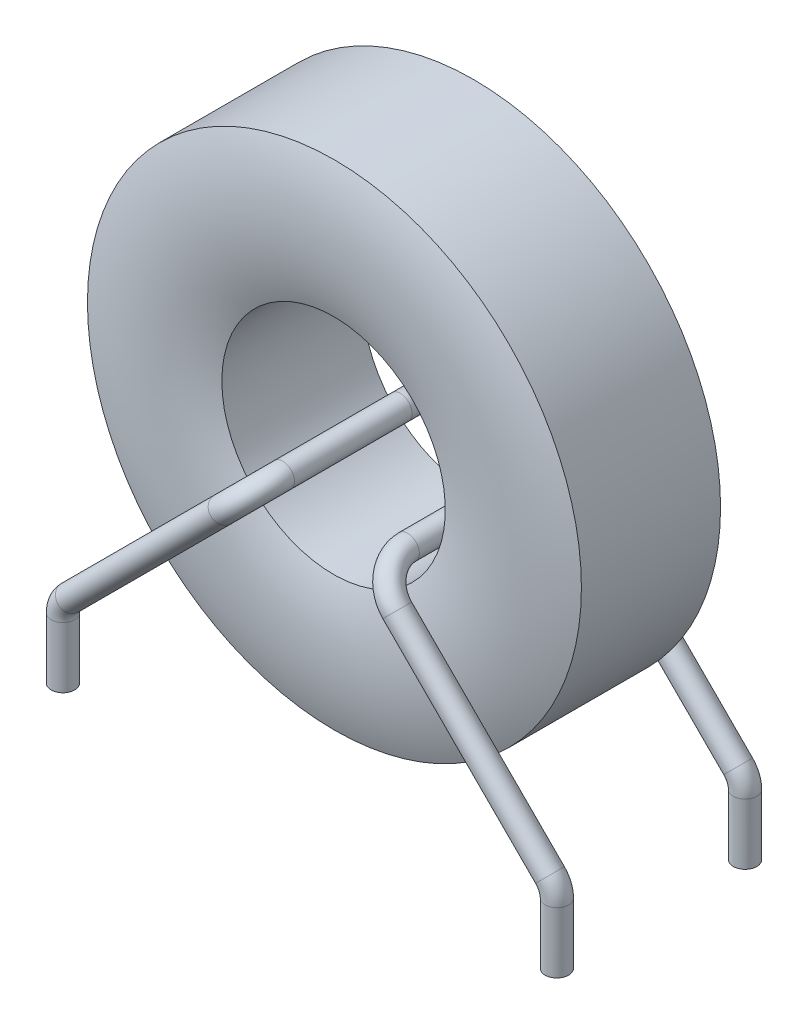
ISO-10303-21;
HEADER;
FILE_DESCRIPTION(('STEP AP214'),'2;1');
FILE_NAME('part.step','',(''),(''),'','','');
FILE_SCHEMA(('AUTOMOTIVE_DESIGN { 1 0 10303 214 1 1 1 1 }'));
ENDSEC;
DATA;
#1=APPLICATION_CONTEXT('core data for automotive mechanical design processes');
#2=APPLICATION_PROTOCOL_DEFINITION('international standard','automotive_design',2000,#1);
#3=PRODUCT_CONTEXT('',#1,'mechanical');
#4=PRODUCT('Part','Part','',(#3));
#5=PRODUCT_RELATED_PRODUCT_CATEGORY('part','',(#4));
#6=PRODUCT_DEFINITION_FORMATION('','',#4);
#7=PRODUCT_DEFINITION_CONTEXT('part definition',#1,'design');
#8=PRODUCT_DEFINITION('design','',#6,#7);
#9=PRODUCT_DEFINITION_SHAPE('','',#8);
#10=(LENGTH_UNIT() NAMED_UNIT(*) SI_UNIT(.MILLI.,.METRE.));
#11=(NAMED_UNIT(*) PLANE_ANGLE_UNIT() SI_UNIT($,.RADIAN.));
#12=(NAMED_UNIT(*) SI_UNIT($,.STERADIAN.) SOLID_ANGLE_UNIT());
#13=UNCERTAINTY_MEASURE_WITH_UNIT(LENGTH_MEASURE(1.E-05),#10,'distance_accuracy_value','');
#14=(GEOMETRIC_REPRESENTATION_CONTEXT(3) GLOBAL_UNCERTAINTY_ASSIGNED_CONTEXT((#13)) GLOBAL_UNIT_ASSIGNED_CONTEXT((#10,
#11,#12)) REPRESENTATION_CONTEXT('',''));
#15=CARTESIAN_POINT('',(0.,0.,0.));
#16=DIRECTION('',(0.,0.,1.));
#17=DIRECTION('',(1.,0.,0.));
#18=AXIS2_PLACEMENT_3D('',#15,#16,#17);
#19=CARTESIAN_POINT('',(10.5000000000002,-10.9142135623731,4.));
#20=DIRECTION('',(0.,-1.,0.));
#21=DIRECTION('',(0.,0.,-1.));
#22=AXIS2_PLACEMENT_3D('',#19,#20,#21);
#23=CYLINDRICAL_SURFACE('',#22,0.5);
#24=CARTESIAN_POINT('',(10.5000000000002,-10.9142135623731,4.));
#25=DIRECTION('',(0.,-1.,0.));
#26=DIRECTION('',(0.707106781186538,0.,-0.707106781186557));
#27=AXIS2_PLACEMENT_3D('',#24,#25,#26);
#28=CIRCLE('',#27,0.5);
#29=CARTESIAN_POINT('',(11.0000000000002,-10.9142135623731,4.));
#30=VERTEX_POINT('',#29);
#31=EDGE_CURVE('E56',#30,#30,#28,.T.);
#32=ORIENTED_EDGE('',*,*,#31,.T.);
#33=EDGE_LOOP('',(#32));
#34=FACE_BOUND('',#33,.T.);
#35=CARTESIAN_POINT('',(10.5000000000002,-13.5,4.));
#36=DIRECTION('',(0.,-1.,0.));
#37=DIRECTION('',(0.707106781186538,0.,-0.707106781186557));
#38=AXIS2_PLACEMENT_3D('',#35,#36,#37);
#39=CIRCLE('',#38,0.5);
#40=CARTESIAN_POINT('',(10.8535533905935,-13.5,3.64644660940672));
#41=VERTEX_POINT('',#40);
#42=EDGE_CURVE('E11',#41,#41,#39,.T.);
#43=ORIENTED_EDGE('',*,*,#42,.F.);
#44=EDGE_LOOP('',(#43));
#45=FACE_BOUND('',#44,.T.);
#46=ADVANCED_FACE('F49',(#34,#45),#23,.T.);
#47=CARTESIAN_POINT('',(9.50000000000018,-10.9142135623731,4.));
#48=DIRECTION('',(0.,0.,-1.));
#49=DIRECTION('',(-1.,0.,0.));
#50=AXIS2_PLACEMENT_3D('',#47,#48,#49);
#51=TOROIDAL_SURFACE('',#50,1.00000000000001,0.5);
#52=CARTESIAN_POINT('',(10.2071067811867,-10.2071067811865,4.));
#53=DIRECTION('',(0.707106781186557,-0.707106781186538,0.));
#54=DIRECTION('',(0.499999999999987,0.5,-0.707106781186557));
#55=AXIS2_PLACEMENT_3D('',#52,#53,#54);
#56=CIRCLE('',#55,0.5);
#57=CARTESIAN_POINT('',(10.56066017178,-9.85355339059326,4.));
#58=VERTEX_POINT('',#57);
#59=EDGE_CURVE('E62',#58,#58,#56,.T.);
#60=CARTESIAN_POINT('',(9.50000000000018,-10.9142135623731,4.));
#61=DIRECTION('',(0.,0.,-1.));
#62=DIRECTION('',(-1.,0.,0.));
#63=AXIS2_PLACEMENT_3D('',#60,#61,#62);
#64=CIRCLE('',#63,1.50000000000001);
#65=EDGE_CURVE('',#58,#30,#64,.T.);
#66=ORIENTED_EDGE('',*,*,#59,.T.);
#67=ORIENTED_EDGE('',*,*,#31,.F.);
#68=ORIENTED_EDGE('',*,*,#65,.T.);
#69=ORIENTED_EDGE('',*,*,#65,.F.);
#70=EDGE_LOOP('',(#66,#68,#67,#69));
#71=FACE_BOUND('',#70,.T.);
#72=ADVANCED_FACE('F130',(#71),#51,.T.);
#73=CARTESIAN_POINT('',(3.71231060122939,-3.71231060122936,4.));
#74=DIRECTION('',(0.707106781186556,-0.707106781186539,0.));
#75=DIRECTION('',(0.707106781186539,0.707106781186556,0.));
#76=AXIS2_PLACEMENT_3D('',#73,#74,#75);
#77=CYLINDRICAL_SURFACE('',#76,0.5);
#78=CARTESIAN_POINT('',(3.71231060122939,-3.71231060122936,4.));
#79=DIRECTION('',(0.707106781186557,-0.707106781186538,0.));
#80=DIRECTION('',(0.499999999999987,0.5,-0.707106781186557));
#81=AXIS2_PLACEMENT_3D('',#78,#79,#80);
#82=CIRCLE('',#81,0.5);
#83=CARTESIAN_POINT('',(3.71231060122939,-3.71231060122936,4.5));
#84=VERTEX_POINT('',#83);
#85=EDGE_CURVE('E66',#84,#84,#82,.T.);
#86=ORIENTED_EDGE('',*,*,#85,.T.);
#87=EDGE_LOOP('',(#86));
#88=FACE_BOUND('',#87,.T.);
#89=ORIENTED_EDGE('',*,*,#59,.F.);
#90=EDGE_LOOP('',(#89));
#91=FACE_BOUND('',#90,.T.);
#92=ADVANCED_FACE('F134',(#88,#91),#77,.T.);
#93=CARTESIAN_POINT('',(3.71231060122939,-3.71231060122936,2.5));
#94=DIRECTION('',(0.707106781186538,0.707106781186557,0.));
#95=DIRECTION('',(-0.707106781186557,0.707106781186538,0.));
#96=AXIS2_PLACEMENT_3D('',#93,#94,#95);
#97=TOROIDAL_SURFACE('',#96,1.5,0.5);
#98=CARTESIAN_POINT('',(2.65165042944955,-2.65165042944955,2.5));
#99=DIRECTION('',(0.,0.,1.));
#100=DIRECTION('',(1.,0.,0.));
#101=AXIS2_PLACEMENT_3D('',#98,#99,#100);
#102=CIRCLE('',#101,0.5);
#103=CARTESIAN_POINT('',(2.29809703885627,-2.29809703885628,2.5));
#104=VERTEX_POINT('',#103);
#105=EDGE_CURVE('E72',#104,#104,#102,.T.);
#106=CARTESIAN_POINT('',(3.71231060122939,-3.71231060122936,2.5));
#107=DIRECTION('',(0.707106781186538,0.707106781186557,0.));
#108=DIRECTION('',(-0.707106781186557,0.707106781186538,0.));
#109=AXIS2_PLACEMENT_3D('',#106,#107,#108);
#110=CIRCLE('',#109,2.);
#111=EDGE_CURVE('',#104,#84,#110,.T.);
#112=ORIENTED_EDGE('',*,*,#105,.T.);
#113=ORIENTED_EDGE('',*,*,#85,.F.);
#114=ORIENTED_EDGE('',*,*,#111,.T.);
#115=ORIENTED_EDGE('',*,*,#111,.F.);
#116=EDGE_LOOP('',(#112,#114,#113,#115));
#117=FACE_BOUND('',#116,.T.);
#118=ADVANCED_FACE('F140',(#117),#97,.T.);
#119=CARTESIAN_POINT('',(2.65165042944955,-2.65165042944955,2.5));
#120=DIRECTION('',(0.,0.,-1.));
#121=DIRECTION('',(-1.,0.,0.));
#122=AXIS2_PLACEMENT_3D('',#119,#120,#121);
#123=CYLINDRICAL_SURFACE('',#122,0.5);
#124=ORIENTED_EDGE('',*,*,#105,.F.);
#125=EDGE_LOOP('',(#124));
#126=FACE_BOUND('',#125,.T.);
#127=CARTESIAN_POINT('',(2.65165042944955,-2.65165042944955,-2.5));
#128=DIRECTION('',(0.,0.,1.));
#129=DIRECTION('',(1.,0.,0.));
#130=AXIS2_PLACEMENT_3D('',#127,#128,#129);
#131=CIRCLE('',#130,0.5);
#132=CARTESIAN_POINT('',(2.29809703885627,-2.29809703885628,-2.5));
#133=VERTEX_POINT('',#132);
#134=EDGE_CURVE('E92',#133,#133,#131,.T.);
#135=ORIENTED_EDGE('',*,*,#134,.T.);
#136=EDGE_LOOP('',(#135));
#137=FACE_BOUND('',#136,.T.);
#138=ADVANCED_FACE('F97',(#126,#137),#123,.T.);
#139=CARTESIAN_POINT('',(10.5000000000002,-13.5,4.));
#140=DIRECTION('',(0.,-1.,0.));
#141=DIRECTION('',(0.707106781186538,0.,-0.707106781186557));
#142=AXIS2_PLACEMENT_3D('',#139,#140,#141);
#143=PLANE('',#142);
#144=ORIENTED_EDGE('',*,*,#42,.T.);
#145=EDGE_LOOP('',(#144));
#146=FACE_BOUND('',#145,.T.);
#147=ADVANCED_FACE('F121',(#146),#143,.T.);
#148=CARTESIAN_POINT('',(10.5000000000002,-10.9142135623731,-4.00000000000002));
#149=DIRECTION('',(0.,-1.,0.));
#150=DIRECTION('',(1.,0.,0.));
#151=AXIS2_PLACEMENT_3D('',#148,#149,#150);
#152=CYLINDRICAL_SURFACE('',#151,0.5);
#153=CARTESIAN_POINT('',(10.5000000000002,-10.9142135623731,-4.00000000000002));
#154=DIRECTION('',(0.,1.,0.));
#155=DIRECTION('',(0.707106781186538,0.,0.707106781186557));
#156=AXIS2_PLACEMENT_3D('',#153,#154,#155);
#157=CIRCLE('',#156,0.5);
#158=CARTESIAN_POINT('',(11.0000000000002,-10.9142135623731,-4.00000000000002));
#159=VERTEX_POINT('',#158);
#160=EDGE_CURVE('E80',#159,#159,#157,.T.);
#161=ORIENTED_EDGE('',*,*,#160,.F.);
#162=EDGE_LOOP('',(#161));
#163=FACE_BOUND('',#162,.T.);
#164=CARTESIAN_POINT('',(10.5000000000002,-13.5,-4.00000000000002));
#165=DIRECTION('',(0.,1.,0.));
#166=DIRECTION('',(0.707106781186538,0.,0.707106781186557));
#167=AXIS2_PLACEMENT_3D('',#164,#165,#166);
#168=CIRCLE('',#167,0.5);
#169=CARTESIAN_POINT('',(10.8535533905935,-13.5,-3.64644660940674));
#170=VERTEX_POINT('',#169);
#171=EDGE_CURVE('E76',#170,#170,#168,.T.);
#172=ORIENTED_EDGE('',*,*,#171,.T.);
#173=EDGE_LOOP('',(#172));
#174=FACE_BOUND('',#173,.T.);
#175=ADVANCED_FACE('F115',(#163,#174),#152,.T.);
#176=CARTESIAN_POINT('',(9.50000000000018,-10.9142135623731,-4.00000000000002));
#177=DIRECTION('',(0.,0.,-1.));
#178=DIRECTION('',(-1.,0.,0.));
#179=AXIS2_PLACEMENT_3D('',#176,#177,#178);
#180=TOROIDAL_SURFACE('',#179,1.00000000000001,0.5);
#181=CARTESIAN_POINT('',(10.2071067811867,-10.2071067811865,-4.00000000000002));
#182=DIRECTION('',(-0.707106781186557,0.707106781186538,0.));
#183=DIRECTION('',(0.499999999999988,0.499999999999999,0.707106781186557));
#184=AXIS2_PLACEMENT_3D('',#181,#182,#183);
#185=CIRCLE('',#184,0.5);
#186=CARTESIAN_POINT('',(10.56066017178,-9.85355339059325,-4.00000000000002));
#187=VERTEX_POINT('',#186);
#188=EDGE_CURVE('E84',#187,#187,#185,.T.);
#189=CARTESIAN_POINT('',(9.50000000000018,-10.9142135623731,-4.00000000000002));
#190=DIRECTION('',(0.,0.,-1.));
#191=DIRECTION('',(-1.,0.,0.));
#192=AXIS2_PLACEMENT_3D('',#189,#190,#191);
#193=CIRCLE('',#192,1.50000000000001);
#194=EDGE_CURVE('',#187,#159,#193,.T.);
#195=ORIENTED_EDGE('',*,*,#188,.F.);
#196=ORIENTED_EDGE('',*,*,#160,.T.);
#197=ORIENTED_EDGE('',*,*,#194,.T.);
#198=ORIENTED_EDGE('',*,*,#194,.F.);
#199=EDGE_LOOP('',(#195,#197,#196,#198));
#200=FACE_BOUND('',#199,.T.);
#201=ADVANCED_FACE('F109',(#200),#180,.T.);
#202=CARTESIAN_POINT('',(3.71231060122939,-3.71231060122936,-4.));
#203=DIRECTION('',(0.707106781186557,-0.707106781186538,0.));
#204=DIRECTION('',(0.707106781186538,0.707106781186557,0.));
#205=AXIS2_PLACEMENT_3D('',#202,#203,#204);
#206=CYLINDRICAL_SURFACE('',#205,0.5);
#207=CARTESIAN_POINT('',(3.71231060122939,-3.71231060122936,-4.));
#208=DIRECTION('',(-0.707106781186557,0.707106781186538,0.));
#209=DIRECTION('',(0.499999999999988,0.499999999999999,0.707106781186557));
#210=AXIS2_PLACEMENT_3D('',#207,#208,#209);
#211=CIRCLE('',#210,0.5);
#212=CARTESIAN_POINT('',(3.71231060122939,-3.71231060122936,-4.5));
#213=VERTEX_POINT('',#212);
#214=EDGE_CURVE('E88',#213,#213,#211,.T.);
#215=ORIENTED_EDGE('',*,*,#214,.F.);
#216=EDGE_LOOP('',(#215));
#217=FACE_BOUND('',#216,.T.);
#218=ORIENTED_EDGE('',*,*,#188,.T.);
#219=EDGE_LOOP('',(#218));
#220=FACE_BOUND('',#219,.T.);
#221=ADVANCED_FACE('F103',(#217,#220),#206,.T.);
#222=CARTESIAN_POINT('',(3.71231060122939,-3.71231060122936,-2.5));
#223=DIRECTION('',(-0.707106781186538,-0.707106781186557,0.));
#224=DIRECTION('',(0.707106781186557,-0.707106781186538,0.));
#225=AXIS2_PLACEMENT_3D('',#222,#223,#224);
#226=TOROIDAL_SURFACE('',#225,1.5,0.5);
#227=CARTESIAN_POINT('',(3.71231060122939,-3.71231060122936,-2.5));
#228=DIRECTION('',(-0.707106781186538,-0.707106781186557,0.));
#229=DIRECTION('',(0.707106781186557,-0.707106781186538,0.));
#230=AXIS2_PLACEMENT_3D('',#227,#228,#229);
#231=CIRCLE('',#230,2.);
#232=EDGE_CURVE('',#133,#213,#231,.T.);
#233=ORIENTED_EDGE('',*,*,#134,.F.);
#234=ORIENTED_EDGE('',*,*,#214,.T.);
#235=ORIENTED_EDGE('',*,*,#232,.T.);
#236=ORIENTED_EDGE('',*,*,#232,.F.);
#237=EDGE_LOOP('',(#233,#235,#234,#236));
#238=FACE_BOUND('',#237,.T.);
#239=ADVANCED_FACE('F99',(#238),#226,.T.);
#240=CARTESIAN_POINT('',(10.5000000000002,-13.5,-4.00000000000002));
#241=DIRECTION('',(0.,1.,0.));
#242=DIRECTION('',(0.707106781186538,0.,0.707106781186557));
#243=AXIS2_PLACEMENT_3D('',#240,#241,#242);
#244=PLANE('',#243);
#245=ORIENTED_EDGE('',*,*,#171,.F.);
#246=EDGE_LOOP('',(#245));
#247=FACE_BOUND('',#246,.T.);
#248=ADVANCED_FACE('F102',(#247),#244,.F.);
#249=CLOSED_SHELL('',(#46,#72,#92,#118,#138,#147,#175,#201,#221,#239,#248));
#250=MANIFOLD_SOLID_BREP('B2',#249);
#251=CARTESIAN_POINT('',(-10.5,-10.9142135623731,3.99999997942051));
#252=DIRECTION('',(0.,-1.,0.));
#253=DIRECTION('',(1.,0.,0.));
#254=AXIS2_PLACEMENT_3D('',#251,#252,#253);
#255=CYLINDRICAL_SURFACE('',#254,0.5);
#256=CARTESIAN_POINT('',(-10.5,-10.9142135623731,3.99999997942051));
#257=DIRECTION('',(0.,-1.,0.));
#258=DIRECTION('',(0.707106781186549,0.,0.707106781186546));
#259=AXIS2_PLACEMENT_3D('',#256,#257,#258);
#260=CIRCLE('',#259,0.5);
#261=CARTESIAN_POINT('',(-11.,-10.9142135623731,3.99999997942051));
#262=VERTEX_POINT('',#261);
#263=EDGE_CURVE('E247',#262,#262,#260,.T.);
#264=ORIENTED_EDGE('',*,*,#263,.T.);
#265=EDGE_LOOP('',(#264));
#266=FACE_BOUND('',#265,.T.);
#267=CARTESIAN_POINT('',(-10.5,-13.5,3.99999997942051));
#268=DIRECTION('',(0.,-1.,0.));
#269=DIRECTION('',(0.707106781186549,0.,0.707106781186546));
#270=AXIS2_PLACEMENT_3D('',#267,#268,#269);
#271=CIRCLE('',#270,0.5);
#272=CARTESIAN_POINT('',(-10.1464466094067,-13.5,4.35355337001378));
#273=VERTEX_POINT('',#272);
#274=EDGE_CURVE('E48',#273,#273,#271,.T.);
#275=ORIENTED_EDGE('',*,*,#274,.F.);
#276=EDGE_LOOP('',(#275));
#277=FACE_BOUND('',#276,.T.);
#278=ADVANCED_FACE('F240',(#266,#277),#255,.T.);
#279=CARTESIAN_POINT('',(-9.49999999999999,-10.9142135623731,3.9999999794205));
#280=DIRECTION('',(0.,0.,1.));
#281=DIRECTION('',(1.,0.,0.));
#282=AXIS2_PLACEMENT_3D('',#279,#280,#281);
#283=TOROIDAL_SURFACE('',#282,1.,0.5);
#284=CARTESIAN_POINT('',(-10.2071067811865,-10.2071067811865,3.99999997942051));
#285=DIRECTION('',(-0.707106781186548,-0.707106781186548,0.));
#286=DIRECTION('',(0.500000000000001,-0.499999999999999,0.707106781186548));
#287=AXIS2_PLACEMENT_3D('',#284,#285,#286);
#288=CIRCLE('',#287,0.5);
#289=CARTESIAN_POINT('',(-10.5606601717798,-9.85355339059327,3.99999997942051));
#290=VERTEX_POINT('',#289);
#291=EDGE_CURVE('E253',#290,#290,#288,.T.);
#292=CARTESIAN_POINT('',(-9.49999999999999,-10.9142135623731,3.9999999794205));
#293=DIRECTION('',(0.,0.,1.));
#294=DIRECTION('',(1.,0.,0.));
#295=AXIS2_PLACEMENT_3D('',#292,#293,#294);
#296=CIRCLE('',#295,1.5);
#297=EDGE_CURVE('',#290,#262,#296,.T.);
#298=ORIENTED_EDGE('',*,*,#291,.T.);
#299=ORIENTED_EDGE('',*,*,#263,.F.);
#300=ORIENTED_EDGE('',*,*,#297,.T.);
#301=ORIENTED_EDGE('',*,*,#297,.F.);
#302=EDGE_LOOP('',(#298,#300,#299,#301));
#303=FACE_BOUND('',#302,.T.);
#304=ADVANCED_FACE('F321',(#303),#283,.T.);
#305=CARTESIAN_POINT('',(-3.71231060122937,-3.71231060122937,3.99999997942048));
#306=DIRECTION('',(-0.707106781186548,-0.707106781186548,0.));
#307=DIRECTION('',(0.707106781186547,-0.707106781186548,0.));
#308=AXIS2_PLACEMENT_3D('',#305,#306,#307);
#309=CYLINDRICAL_SURFACE('',#308,0.5);
#310=CARTESIAN_POINT('',(-3.71231060122937,-3.71231060122937,3.99999997942048));
#311=DIRECTION('',(-0.707106781186548,-0.707106781186548,0.));
#312=DIRECTION('',(0.500000000000001,-0.499999999999999,0.707106781186548));
#313=AXIS2_PLACEMENT_3D('',#310,#311,#312);
#314=CIRCLE('',#313,0.5);
#315=CARTESIAN_POINT('',(-3.71231060122937,-3.71231060122937,4.49999997942048));
#316=VERTEX_POINT('',#315);
#317=EDGE_CURVE('E259',#316,#316,#314,.T.);
#318=ORIENTED_EDGE('',*,*,#317,.T.);
#319=EDGE_LOOP('',(#318));
#320=FACE_BOUND('',#319,.T.);
#321=ORIENTED_EDGE('',*,*,#291,.F.);
#322=EDGE_LOOP('',(#321));
#323=FACE_BOUND('',#322,.T.);
#324=ADVANCED_FACE('F325',(#320,#323),#309,.T.);
#325=CARTESIAN_POINT('',(-3.71231060122937,-3.71231060122937,2.49999997942048));
#326=DIRECTION('',(0.707106781186548,-0.707106781186548,0.));
#327=DIRECTION('',(0.707106781186548,0.707106781186548,0.));
#328=AXIS2_PLACEMENT_3D('',#325,#326,#327);
#329=TOROIDAL_SURFACE('',#328,1.5,0.5);
#330=CARTESIAN_POINT('',(-2.65165042944955,-2.65165042944955,2.49999997942048));
#331=DIRECTION('',(0.,0.,1.));
#332=DIRECTION('',(1.,0.,0.));
#333=AXIS2_PLACEMENT_3D('',#330,#331,#332);
#334=CIRCLE('',#333,0.5);
#335=CARTESIAN_POINT('',(-2.29809703885628,-2.29809703885628,2.49999997942048));
#336=VERTEX_POINT('',#335);
#337=EDGE_CURVE('E265',#336,#336,#334,.T.);
#338=CARTESIAN_POINT('',(-3.71231060122937,-3.71231060122937,2.49999997942048));
#339=DIRECTION('',(0.707106781186548,-0.707106781186548,0.));
#340=DIRECTION('',(0.707106781186548,0.707106781186548,0.));
#341=AXIS2_PLACEMENT_3D('',#338,#339,#340);
#342=CIRCLE('',#341,2.);
#343=EDGE_CURVE('',#336,#316,#342,.T.);
#344=ORIENTED_EDGE('',*,*,#337,.T.);
#345=ORIENTED_EDGE('',*,*,#317,.F.);
#346=ORIENTED_EDGE('',*,*,#343,.T.);
#347=ORIENTED_EDGE('',*,*,#343,.F.);
#348=EDGE_LOOP('',(#344,#346,#345,#347));
#349=FACE_BOUND('',#348,.T.);
#350=ADVANCED_FACE('F331',(#349),#329,.T.);
#351=CARTESIAN_POINT('',(-2.65165042944955,-2.65165042944955,2.49999997942048));
#352=DIRECTION('',(0.,0.,-1.));
#353=DIRECTION('',(-1.,0.,0.));
#354=AXIS2_PLACEMENT_3D('',#351,#352,#353);
#355=CYLINDRICAL_SURFACE('',#354,0.5);
#356=ORIENTED_EDGE('',*,*,#337,.F.);
#357=EDGE_LOOP('',(#356));
#358=FACE_BOUND('',#357,.T.);
#359=CARTESIAN_POINT('',(-2.65165042944955,-2.65165042944955,-2.5));
#360=DIRECTION('',(0.,0.,1.));
#361=DIRECTION('',(1.,0.,0.));
#362=AXIS2_PLACEMENT_3D('',#359,#360,#361);
#363=CIRCLE('',#362,0.5);
#364=CARTESIAN_POINT('',(-2.29809703885628,-2.29809703885628,-2.5));
#365=VERTEX_POINT('',#364);
#366=EDGE_CURVE('E283',#365,#365,#363,.T.);
#367=ORIENTED_EDGE('',*,*,#366,.T.);
#368=EDGE_LOOP('',(#367));
#369=FACE_BOUND('',#368,.T.);
#370=ADVANCED_FACE('F288',(#358,#369),#355,.T.);
#371=CARTESIAN_POINT('',(-10.5,-13.5,3.99999997942051));
#372=DIRECTION('',(0.,-1.,0.));
#373=DIRECTION('',(0.707106781186549,0.,0.707106781186546));
#374=AXIS2_PLACEMENT_3D('',#371,#372,#373);
#375=PLANE('',#374);
#376=ORIENTED_EDGE('',*,*,#274,.T.);
#377=EDGE_LOOP('',(#376));
#378=FACE_BOUND('',#377,.T.);
#379=ADVANCED_FACE('F312',(#378),#375,.T.);
#380=CARTESIAN_POINT('',(-10.5,-10.9142135623731,-4.));
#381=DIRECTION('',(0.,-1.,0.));
#382=DIRECTION('',(0.,0.,-1.));
#383=AXIS2_PLACEMENT_3D('',#380,#381,#382);
#384=CYLINDRICAL_SURFACE('',#383,0.5);
#385=CARTESIAN_POINT('',(-10.5,-10.9142135623731,-4.));
#386=DIRECTION('',(0.,1.,0.));
#387=DIRECTION('',(0.707106781186548,0.,-0.707106781186548));
#388=AXIS2_PLACEMENT_3D('',#385,#386,#387);
#389=CIRCLE('',#388,0.5);
#390=CARTESIAN_POINT('',(-11.,-10.9142135623731,-4.));
#391=VERTEX_POINT('',#390);
#392=EDGE_CURVE('E273',#391,#391,#389,.T.);
#393=ORIENTED_EDGE('',*,*,#392,.F.);
#394=EDGE_LOOP('',(#393));
#395=FACE_BOUND('',#394,.T.);
#396=CARTESIAN_POINT('',(-10.5,-13.5,-4.));
#397=DIRECTION('',(0.,1.,0.));
#398=DIRECTION('',(0.707106781186548,0.,-0.707106781186548));
#399=AXIS2_PLACEMENT_3D('',#396,#397,#398);
#400=CIRCLE('',#399,0.5);
#401=CARTESIAN_POINT('',(-10.1464466094067,-13.5,-4.35355339059327));
#402=VERTEX_POINT('',#401);
#403=EDGE_CURVE('E269',#402,#402,#400,.T.);
#404=ORIENTED_EDGE('',*,*,#403,.T.);
#405=EDGE_LOOP('',(#404));
#406=FACE_BOUND('',#405,.T.);
#407=ADVANCED_FACE('F306',(#395,#406),#384,.T.);
#408=CARTESIAN_POINT('',(-9.5,-10.9142135623731,-4.));
#409=DIRECTION('',(0.,0.,1.));
#410=DIRECTION('',(1.,0.,0.));
#411=AXIS2_PLACEMENT_3D('',#408,#409,#410);
#412=TOROIDAL_SURFACE('',#411,1.,0.5);
#413=CARTESIAN_POINT('',(-10.2071067811865,-10.2071067811865,-4.));
#414=DIRECTION('',(0.707106781186548,0.707106781186548,0.));
#415=DIRECTION('',(0.500000000000001,-0.5,-0.707106781186548));
#416=AXIS2_PLACEMENT_3D('',#413,#414,#415);
#417=CIRCLE('',#416,0.5);
#418=CARTESIAN_POINT('',(-10.5606601717798,-9.85355339059327,-4.));
#419=VERTEX_POINT('',#418);
#420=EDGE_CURVE('E277',#419,#419,#417,.T.);
#421=CARTESIAN_POINT('',(-9.5,-10.9142135623731,-4.));
#422=DIRECTION('',(0.,0.,1.));
#423=DIRECTION('',(1.,0.,0.));
#424=AXIS2_PLACEMENT_3D('',#421,#422,#423);
#425=CIRCLE('',#424,1.5);
#426=EDGE_CURVE('',#419,#391,#425,.T.);
#427=ORIENTED_EDGE('',*,*,#420,.F.);
#428=ORIENTED_EDGE('',*,*,#392,.T.);
#429=ORIENTED_EDGE('',*,*,#426,.T.);
#430=ORIENTED_EDGE('',*,*,#426,.F.);
#431=EDGE_LOOP('',(#427,#429,#428,#430));
#432=FACE_BOUND('',#431,.T.);
#433=ADVANCED_FACE('F300',(#432),#412,.T.);
#434=CARTESIAN_POINT('',(-3.71231060122937,-3.71231060122937,-4.));
#435=DIRECTION('',(-0.707106781186548,-0.707106781186548,0.));
#436=DIRECTION('',(0.707106781186548,-0.707106781186548,0.));
#437=AXIS2_PLACEMENT_3D('',#434,#435,#436);
#438=CYLINDRICAL_SURFACE('',#437,0.5);
#439=CARTESIAN_POINT('',(-3.71231060122937,-3.71231060122937,-4.));
#440=DIRECTION('',(0.707106781186548,0.707106781186548,0.));
#441=DIRECTION('',(0.500000000000001,-0.5,-0.707106781186548));
#442=AXIS2_PLACEMENT_3D('',#439,#440,#441);
#443=CIRCLE('',#442,0.5);
#444=CARTESIAN_POINT('',(-3.71231060122937,-3.71231060122937,-4.5));
#445=VERTEX_POINT('',#444);
#446=EDGE_CURVE('E280',#445,#445,#443,.T.);
#447=ORIENTED_EDGE('',*,*,#446,.F.);
#448=EDGE_LOOP('',(#447));
#449=FACE_BOUND('',#448,.T.);
#450=ORIENTED_EDGE('',*,*,#420,.T.);
#451=EDGE_LOOP('',(#450));
#452=FACE_BOUND('',#451,.T.);
#453=ADVANCED_FACE('F294',(#449,#452),#438,.T.);
#454=CARTESIAN_POINT('',(-3.71231060122938,-3.71231060122937,-2.5));
#455=DIRECTION('',(-0.707106781186548,0.707106781186548,0.));
#456=DIRECTION('',(-0.707106781186548,-0.707106781186548,0.));
#457=AXIS2_PLACEMENT_3D('',#454,#455,#456);
#458=TOROIDAL_SURFACE('',#457,1.5,0.5);
#459=CARTESIAN_POINT('',(-3.71231060122938,-3.71231060122937,-2.5));
#460=DIRECTION('',(-0.707106781186548,0.707106781186548,0.));
#461=DIRECTION('',(-0.707106781186548,-0.707106781186548,0.));
#462=AXIS2_PLACEMENT_3D('',#459,#460,#461);
#463=CIRCLE('',#462,2.);
#464=EDGE_CURVE('',#365,#445,#463,.T.);
#465=ORIENTED_EDGE('',*,*,#366,.F.);
#466=ORIENTED_EDGE('',*,*,#446,.T.);
#467=ORIENTED_EDGE('',*,*,#464,.T.);
#468=ORIENTED_EDGE('',*,*,#464,.F.);
#469=EDGE_LOOP('',(#465,#467,#466,#468));
#470=FACE_BOUND('',#469,.T.);
#471=ADVANCED_FACE('F290',(#470),#458,.T.);
#472=CARTESIAN_POINT('',(-10.5,-13.5,-4.));
#473=DIRECTION('',(0.,1.,0.));
#474=DIRECTION('',(0.707106781186548,0.,-0.707106781186548));
#475=AXIS2_PLACEMENT_3D('',#472,#473,#474);
#476=PLANE('',#475);
#477=ORIENTED_EDGE('',*,*,#403,.F.);
#478=EDGE_LOOP('',(#477));
#479=FACE_BOUND('',#478,.T.);
#480=ADVANCED_FACE('F293',(#479),#476,.F.);
#481=CLOSED_SHELL('',(#278,#304,#324,#350,#370,#379,#407,#433,#453,#471,#480));
#482=MANIFOLD_SOLID_BREP('B6',#481);
#483=CARTESIAN_POINT('',(0.,0.,4.65090128772414));
#484=DIRECTION('',(0.,0.,-1.));
#485=DIRECTION('',(-1.,0.,0.));
#486=AXIS2_PLACEMENT_3D('',#483,#484,#485);
#487=DEGENERATE_TOROIDAL_SURFACE('',#486,7.57677980996658,8.1510641867068,.T.);
#488=CARTESIAN_POINT('',(0.,0.,-2.99430396012757));
#489=DIRECTION('',(0.,0.,-1.));
#490=DIRECTION('',(-1.,0.,0.));
#491=AXIS2_PLACEMENT_3D('',#488,#489,#490);
#492=CIRCLE('',#491,4.75);
#493=CARTESIAN_POINT('',(-4.75,0.,-2.99430396012757));
#494=VERTEX_POINT('',#493);
#495=EDGE_CURVE('E441',#494,#494,#492,.T.);
#496=ORIENTED_EDGE('',*,*,#495,.F.);
#497=EDGE_LOOP('',(#496));
#498=FACE_BOUND('',#497,.T.);
#499=CARTESIAN_POINT('',(0.,0.,-2.95795086594497));
#500=DIRECTION('',(0.,0.,-1.));
#501=DIRECTION('',(-1.,0.,0.));
#502=AXIS2_PLACEMENT_3D('',#499,#500,#501);
#503=CIRCLE('',#502,10.5);
#504=CARTESIAN_POINT('',(-10.5,0.,-2.95795086594497));
#505=VERTEX_POINT('',#504);
#506=EDGE_CURVE('E239',#505,#505,#503,.T.);
#507=ORIENTED_EDGE('',*,*,#506,.T.);
#508=EDGE_LOOP('',(#507));
#509=FACE_BOUND('',#508,.T.);
#510=ADVANCED_FACE('F424',(#498,#509),#487,.T.);
#511=CARTESIAN_POINT('',(0.,0.,-4.30769230769231));
#512=DIRECTION('',(0.,0.,-1.));
#513=DIRECTION('',(-1.,0.,0.));
#514=AXIS2_PLACEMENT_3D('',#511,#512,#513);
#515=CYLINDRICAL_SURFACE('',#514,10.5);
#516=ORIENTED_EDGE('',*,*,#506,.F.);
#517=EDGE_LOOP('',(#516));
#518=FACE_BOUND('',#517,.T.);
#519=CARTESIAN_POINT('',(0.,0.,2.95795086594497));
#520=DIRECTION('',(0.,0.,-1.));
#521=DIRECTION('',(-1.,0.,0.));
#522=AXIS2_PLACEMENT_3D('',#519,#520,#521);
#523=CIRCLE('',#522,10.5);
#524=CARTESIAN_POINT('',(-10.5,0.,2.95795086594497));
#525=VERTEX_POINT('',#524);
#526=EDGE_CURVE('E431',#525,#525,#523,.T.);
#527=ORIENTED_EDGE('',*,*,#526,.T.);
#528=EDGE_LOOP('',(#527));
#529=FACE_BOUND('',#528,.T.);
#530=ADVANCED_FACE('F451',(#518,#529),#515,.T.);
#531=CARTESIAN_POINT('',(0.,0.,-4.65090128772414));
#532=DIRECTION('',(0.,0.,-1.));
#533=DIRECTION('',(-1.,0.,0.));
#534=AXIS2_PLACEMENT_3D('',#531,#532,#533);
#535=DEGENERATE_TOROIDAL_SURFACE('',#534,7.57677980996658,8.1510641867068,.T.);
#536=ORIENTED_EDGE('',*,*,#526,.F.);
#537=EDGE_LOOP('',(#536));
#538=FACE_BOUND('',#537,.T.);
#539=CARTESIAN_POINT('',(0.,0.,2.99430396012757));
#540=DIRECTION('',(0.,0.,-1.));
#541=DIRECTION('',(-1.,0.,0.));
#542=AXIS2_PLACEMENT_3D('',#539,#540,#541);
#543=CIRCLE('',#542,4.75);
#544=CARTESIAN_POINT('',(-4.75,0.,2.99430396012757));
#545=VERTEX_POINT('',#544);
#546=EDGE_CURVE('E436',#545,#545,#543,.T.);
#547=ORIENTED_EDGE('',*,*,#546,.T.);
#548=EDGE_LOOP('',(#547));
#549=FACE_BOUND('',#548,.T.);
#550=ADVANCED_FACE('F455',(#538,#549),#535,.T.);
#551=CARTESIAN_POINT('',(0.,0.,-4.30769230769231));
#552=DIRECTION('',(0.,0.,-1.));
#553=DIRECTION('',(-1.,0.,0.));
#554=AXIS2_PLACEMENT_3D('',#551,#552,#553);
#555=CYLINDRICAL_SURFACE('',#554,4.75);
#556=ORIENTED_EDGE('',*,*,#546,.F.);
#557=EDGE_LOOP('',(#556));
#558=FACE_BOUND('',#557,.T.);
#559=ORIENTED_EDGE('',*,*,#495,.T.);
#560=EDGE_LOOP('',(#559));
#561=FACE_BOUND('',#560,.T.);
#562=ADVANCED_FACE('F448',(#558,#561),#555,.F.);
#563=CLOSED_SHELL('',(#510,#530,#550,#562));
#564=MANIFOLD_SOLID_BREP('B43',#563);
#565=ADVANCED_BREP_SHAPE_REPRESENTATION('',(#18,#250,#482,#564),#14);
#566=SHAPE_DEFINITION_REPRESENTATION(#9,#565);
ENDSEC;
END-ISO-10303-21;
